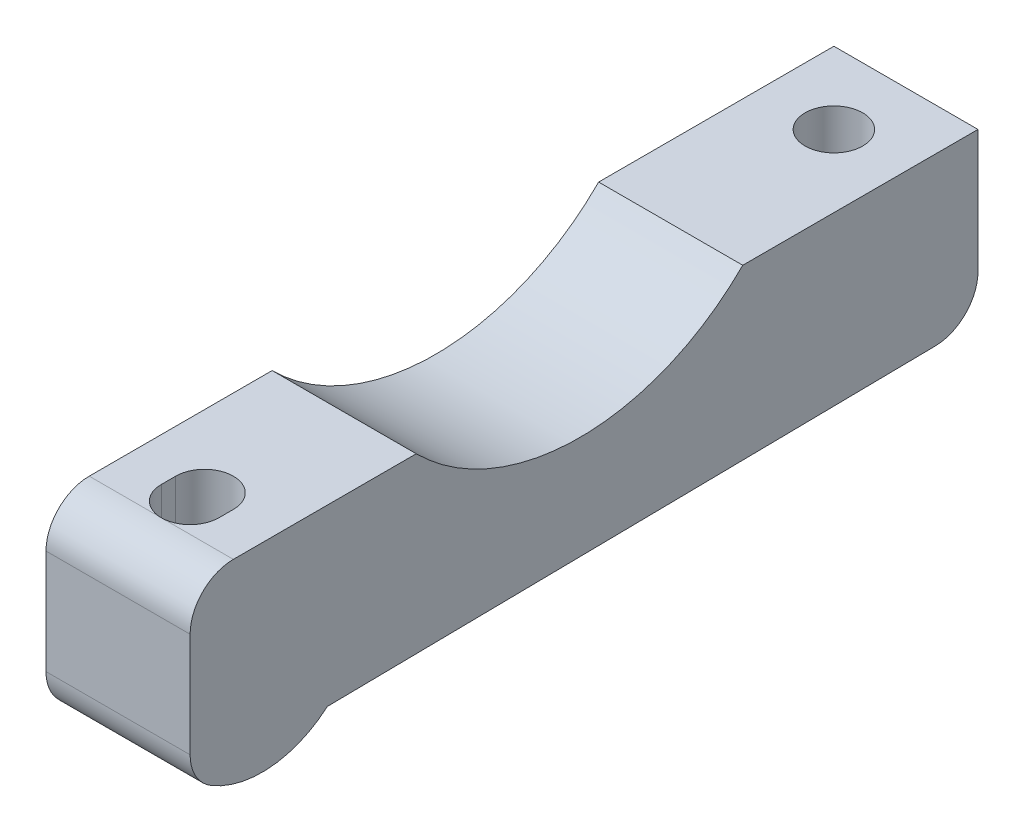
ISO-10303-21;
HEADER;
FILE_DESCRIPTION(('STEP AP214'),'2;1');
FILE_NAME('part.step','',(''),(''),'','','');
FILE_SCHEMA(('AUTOMOTIVE_DESIGN { 1 0 10303 214 1 1 1 1 }'));
ENDSEC;
DATA;
#1=APPLICATION_CONTEXT('core data for automotive mechanical design processes');
#2=APPLICATION_PROTOCOL_DEFINITION('international standard','automotive_design',2000,#1);
#3=PRODUCT_CONTEXT('',#1,'mechanical');
#4=PRODUCT('Part','Part','',(#3));
#5=PRODUCT_RELATED_PRODUCT_CATEGORY('part','',(#4));
#6=PRODUCT_DEFINITION_FORMATION('','',#4);
#7=PRODUCT_DEFINITION_CONTEXT('part definition',#1,'design');
#8=PRODUCT_DEFINITION('design','',#6,#7);
#9=PRODUCT_DEFINITION_SHAPE('','',#8);
#10=(LENGTH_UNIT() NAMED_UNIT(*) SI_UNIT(.MILLI.,.METRE.));
#11=(NAMED_UNIT(*) PLANE_ANGLE_UNIT() SI_UNIT($,.RADIAN.));
#12=(NAMED_UNIT(*) SI_UNIT($,.STERADIAN.) SOLID_ANGLE_UNIT());
#13=UNCERTAINTY_MEASURE_WITH_UNIT(LENGTH_MEASURE(1.E-05),#10,'distance_accuracy_value','');
#14=(GEOMETRIC_REPRESENTATION_CONTEXT(3) GLOBAL_UNCERTAINTY_ASSIGNED_CONTEXT((#13)) GLOBAL_UNIT_ASSIGNED_CONTEXT((#10,
#11,#12)) REPRESENTATION_CONTEXT('',''));
#15=CARTESIAN_POINT('',(0.,0.,0.));
#16=DIRECTION('',(0.,0.,1.));
#17=DIRECTION('',(1.,0.,0.));
#18=AXIS2_PLACEMENT_3D('',#15,#16,#17);
#19=CARTESIAN_POINT('',(10.,-48.1039360432918,78.0002606467157));
#20=DIRECTION('',(0.,0.999908795025806,0.0135056147598018));
#21=DIRECTION('',(0.,-0.0135056147598018,0.999908795025806));
#22=AXIS2_PLACEMENT_3D('',#19,#20,#21);
#23=PLANE('',#22);
#24=DIRECTION('',(0.,0.0135056147598018,-0.999908795025806));
#25=VECTOR('',#24,1.);
#26=CARTESIAN_POINT('',(1.37747997155113,-48.1039360432918,78.0002606467157));
#27=LINE('',#26,#25);
#28=CARTESIAN_POINT('',(1.37747997155111,-47.5898571434518,39.9396449376715));
#29=VERTEX_POINT('',#28);
#30=CARTESIAN_POINT('',(1.37747997155111,-47.5340471264958,35.8076651798224));
#31=VERTEX_POINT('',#30);
#32=EDGE_CURVE('E286',#29,#31,#27,.T.);
#33=ORIENTED_EDGE('',*,*,#32,.F.);
#34=DIRECTION('',(-0.866005655302022,0.0067532693234498,-0.49998859820836));
#35=VECTOR('',#34,1.);
#36=CARTESIAN_POINT('',(24.3270599960651,-47.7688221349812,53.1895911426136));
#37=LINE('',#36,#35);
#38=CARTESIAN_POINT('',(5.00000000000001,-47.6181062123025,42.0311078512413));
#39=VERTEX_POINT('',#38);
#40=EDGE_CURVE('E14',#39,#29,#37,.T.);
#41=ORIENTED_EDGE('',*,*,#40,.F.);
#42=DIRECTION('',(-0.866005655302021,-0.00675326932344981,0.499988598208361));
#43=VECTOR('',#42,1.);
#44=CARTESIAN_POINT('',(-6.82740204591432,-47.7103384407224,48.8596616062639));
#45=LINE('',#44,#43);
#46=CARTESIAN_POINT('',(8.62252002844889,-47.5898571434518,39.9396449376715));
#47=VERTEX_POINT('',#46);
#48=EDGE_CURVE('E54',#47,#39,#45,.T.);
#49=ORIENTED_EDGE('',*,*,#48,.F.);
#50=DIRECTION('',(0.,-0.0135056147598018,0.999908795025806));
#51=VECTOR('',#50,1.);
#52=CARTESIAN_POINT('',(8.62252002844891,-48.1039360432918,78.0002606467157));
#53=LINE('',#52,#51);
#54=CARTESIAN_POINT('',(8.62252002844889,-47.5340471264958,35.8076651798224));
#55=VERTEX_POINT('',#54);
#56=EDGE_CURVE('E255',#55,#47,#53,.T.);
#57=ORIENTED_EDGE('',*,*,#56,.F.);
#58=DIRECTION('',(-1.,0.,0.));
#59=VECTOR('',#58,1.);
#60=CARTESIAN_POINT('',(10.,-47.5340471264958,35.8076651798224));
#61=LINE('',#60,#59);
#62=CARTESIAN_POINT('',(10.,-47.5340471264958,35.8076651798224));
#63=VERTEX_POINT('',#62);
#64=EDGE_CURVE('E245',#63,#55,#61,.T.);
#65=ORIENTED_EDGE('',*,*,#64,.F.);
#66=DIRECTION('',(0.,0.0135056147598018,-0.999908795025806));
#67=VECTOR('',#66,1.);
#68=CARTESIAN_POINT('',(10.,-48.1039360432918,78.0002606467157));
#69=LINE('',#68,#67);
#70=CARTESIAN_POINT('',(10.,-48.1039360432918,78.0002606467157));
#71=VERTEX_POINT('',#70);
#72=EDGE_CURVE('E360',#71,#63,#69,.T.);
#73=ORIENTED_EDGE('',*,*,#72,.F.);
#74=DIRECTION('',(-1.,0.,0.));
#75=VECTOR('',#74,1.);
#76=CARTESIAN_POINT('',(10.,-48.1039360432918,78.0002606467157));
#77=LINE('',#76,#75);
#78=CARTESIAN_POINT('',(0.,-48.1039360432918,78.0002606467157));
#79=VERTEX_POINT('',#78);
#80=EDGE_CURVE('E248',#71,#79,#77,.T.);
#81=ORIENTED_EDGE('',*,*,#80,.T.);
#82=DIRECTION('',(0.,0.0135056147598018,-0.999908795025806));
#83=VECTOR('',#82,1.);
#84=CARTESIAN_POINT('',(0.,-48.1039360432918,78.0002606467157));
#85=LINE('',#84,#83);
#86=CARTESIAN_POINT('',(0.,-47.5340471264958,35.8076651798224));
#87=VERTEX_POINT('',#86);
#88=EDGE_CURVE('E377',#79,#87,#85,.T.);
#89=ORIENTED_EDGE('',*,*,#88,.T.);
#90=EDGE_CURVE('E244',#31,#87,#61,.T.);
#91=ORIENTED_EDGE('',*,*,#90,.F.);
#92=EDGE_LOOP('',(#33,#41,#49,#57,#65,#73,#81,#89,#91));
#93=FACE_BOUND('',#92,.T.);
#94=ADVANCED_FACE('F45',(#93),#23,.F.);
#95=CARTESIAN_POINT('',(10.,-44.5343207414184,35.8481820241018));
#96=DIRECTION('',(-1.,0.,0.));
#97=DIRECTION('',(0.,0.,1.));
#98=AXIS2_PLACEMENT_3D('',#95,#96,#97);
#99=CYLINDRICAL_SURFACE('',#98,3.);
#100=CARTESIAN_POINT('',(1.37747997155111,-44.5343207414184,35.8481820241018));
#101=DIRECTION('',(1.,0.,0.));
#102=DIRECTION('',(0.,0.,-1.));
#103=AXIS2_PLACEMENT_3D('',#100,#101,#102);
#104=CIRCLE('',#103,3.);
#105=CARTESIAN_POINT('',(1.37747997155111,-47.5329261731885,35.756719110532));
#106=VERTEX_POINT('',#105);
#107=EDGE_CURVE('E262',#31,#106,#104,.T.);
#108=ORIENTED_EDGE('',*,*,#107,.F.);
#109=ORIENTED_EDGE('',*,*,#90,.T.);
#110=CARTESIAN_POINT('',(0.,-44.5343207414184,35.8481820241018));
#111=DIRECTION('',(1.,0.,0.));
#112=DIRECTION('',(0.,0.,-1.));
#113=AXIS2_PLACEMENT_3D('',#110,#111,#112);
#114=CIRCLE('',#113,3.);
#115=CARTESIAN_POINT('',(0.,-44.5343207414184,32.8481820241018));
#116=VERTEX_POINT('',#115);
#117=EDGE_CURVE('E379',#87,#116,#114,.T.);
#118=ORIENTED_EDGE('',*,*,#117,.T.);
#119=DIRECTION('',(-1.,0.,0.));
#120=VECTOR('',#119,1.);
#121=CARTESIAN_POINT('',(10.,-44.5343207414184,32.8481820241018));
#122=LINE('',#121,#120);
#123=CARTESIAN_POINT('',(10.,-44.5343207414184,32.8481820241018));
#124=VERTEX_POINT('',#123);
#125=EDGE_CURVE('E241',#124,#116,#122,.T.);
#126=ORIENTED_EDGE('',*,*,#125,.F.);
#127=CARTESIAN_POINT('',(10.,-44.5343207414184,35.8481820241018));
#128=DIRECTION('',(1.,0.,0.));
#129=DIRECTION('',(0.,0.,-1.));
#130=AXIS2_PLACEMENT_3D('',#127,#128,#129);
#131=CIRCLE('',#130,3.);
#132=EDGE_CURVE('E362',#63,#124,#131,.T.);
#133=ORIENTED_EDGE('',*,*,#132,.F.);
#134=ORIENTED_EDGE('',*,*,#64,.T.);
#135=CARTESIAN_POINT('',(8.62252002844889,-44.5343207414184,35.8481820241018));
#136=DIRECTION('',(-1.,0.,0.));
#137=DIRECTION('',(0.,0.,1.));
#138=AXIS2_PLACEMENT_3D('',#135,#136,#137);
#139=CIRCLE('',#138,3.);
#140=CARTESIAN_POINT('',(8.62252002844889,-47.5329261731885,35.756719110532));
#141=VERTEX_POINT('',#140);
#142=EDGE_CURVE('E251',#141,#55,#139,.T.);
#143=ORIENTED_EDGE('',*,*,#142,.F.);
#144=CARTESIAN_POINT('',(8.78093844176006,-44.5343207414184,35.8481820241018));
#145=DIRECTION('',(-0.499999999999998,0.,0.86602540378444));
#146=DIRECTION('',(-0.86602540378444,0.,-0.499999999999998));
#147=AXIS2_PLACEMENT_3D('',#144,#145,#146);
#148=ELLIPSE('',#147,6.00000000000003,3.);
#149=CARTESIAN_POINT('',(5.,-46.5921921740417,33.6652561969622));
#150=VERTEX_POINT('',#149);
#151=EDGE_CURVE('E258',#150,#141,#148,.T.);
#152=ORIENTED_EDGE('',*,*,#151,.F.);
#153=CARTESIAN_POINT('',(1.21906155823997,-44.5343207414184,35.8481820241018));
#154=DIRECTION('',(0.5,0.,0.866025403784439));
#155=DIRECTION('',(-0.866025403784439,0.,0.5));
#156=AXIS2_PLACEMENT_3D('',#153,#154,#155);
#157=ELLIPSE('',#156,6.,3.);
#158=EDGE_CURVE('E260',#106,#150,#157,.T.);
#159=ORIENTED_EDGE('',*,*,#158,.F.);
#160=EDGE_LOOP('',(#108,#109,#118,#126,#133,#134,#143,#152,#159));
#161=FACE_BOUND('',#160,.T.);
#162=ADVANCED_FACE('F394',(#161),#99,.T.);
#163=CARTESIAN_POINT('',(10.,-42.9198410491219,82.5239953031053));
#164=DIRECTION('',(-1.,0.,0.));
#165=DIRECTION('',(0.,0.,1.));
#166=AXIS2_PLACEMENT_3D('',#163,#164,#165);
#167=CYLINDRICAL_SURFACE('',#166,6.88033546783859);
#168=CARTESIAN_POINT('',(3.,-49.8001765169605,82.5239953031054));
#169=CARTESIAN_POINT('',(2.99999908750125,-49.8001801191236,82.5790352856475));
#170=CARTESIAN_POINT('',(3.00227351354645,-49.799515272154,82.6340478316025));
#171=CARTESIAN_POINT('',(3.01133866120404,-49.7968870928086,82.7436579638859));
#172=CARTESIAN_POINT('',(3.01812852478686,-49.7949240071264,82.7982556270578));
#173=CARTESIAN_POINT('',(3.04516389881666,-49.7871610029691,82.9605748329965));
#174=CARTESIAN_POINT('',(3.07207570574423,-49.7794868508105,83.06717509479));
#175=CARTESIAN_POINT('',(3.1427711427662,-49.7599561568413,83.2741119244492));
#176=CARTESIAN_POINT('',(3.1865514705626,-49.7481004336823,83.3744497138351));
#177=CARTESIAN_POINT('',(3.28966070346656,-49.7214439270112,83.5664009925472));
#178=CARTESIAN_POINT('',(3.34899521404478,-49.7066420822295,83.6580113203796));
#179=CARTESIAN_POINT('',(3.48320834123886,-49.6752332256806,83.8323291297511));
#180=CARTESIAN_POINT('',(3.55842914771926,-49.6585911312054,83.9147666995699));
#181=CARTESIAN_POINT('',(3.72155640469726,-49.625589589224,84.0660589524453));
#182=CARTESIAN_POINT('',(3.80946559659227,-49.609230203656,84.1349106925776));
#183=CARTESIAN_POINT('',(3.99772932479587,-49.5782777752942,84.2584664592139));
#184=CARTESIAN_POINT('',(4.09830556302418,-49.5637287932854,84.3128447353406));
#185=CARTESIAN_POINT('',(4.30766096344512,-49.5385702160399,84.4038046570536));
#186=CARTESIAN_POINT('',(4.4164378926445,-49.5279595530531,84.4403911271584));
#187=CARTESIAN_POINT('',(4.63607550907942,-49.5122447463226,84.4937644728676));
#188=CARTESIAN_POINT('',(4.74680504491993,-49.5070024191648,84.5110493044696));
#189=CARTESIAN_POINT('',(4.969709265211,-49.5022061979605,84.5268831391609));
#190=CARTESIAN_POINT('',(5.0818836501859,-49.5026511434735,84.5254359643588));
#191=CARTESIAN_POINT('',(5.30048736436622,-49.509056589041,84.5042384740849));
#192=CARTESIAN_POINT('',(5.40698296056521,-49.5148308746578,84.4851060702752));
#193=CARTESIAN_POINT('',(5.61518150341124,-49.5309439392077,84.4300772915553));
#194=CARTESIAN_POINT('',(5.71688405284008,-49.5412830957157,84.3941795299156));
#195=CARTESIAN_POINT('',(5.91415178675121,-49.5655140068084,84.3061697822286));
#196=CARTESIAN_POINT('',(6.00961970554332,-49.5794503070672,84.253852569739));
#197=CARTESIAN_POINT('',(6.19062985521666,-49.6092827959936,84.1346322922063));
#198=CARTESIAN_POINT('',(6.27616995428165,-49.6251794040953,84.0677261032961));
#199=CARTESIAN_POINT('',(6.4384021598558,-49.6579009394484,83.9181405887993));
#200=CARTESIAN_POINT('',(6.51461936131665,-49.6747378978858,83.8349480609914));
#201=CARTESIAN_POINT('',(6.65214298929749,-49.7068956247485,83.6567316035264));
#202=CARTESIAN_POINT('',(6.71344563755355,-49.7222160084021,83.5617046850931));
#203=CARTESIAN_POINT('',(6.81967124099461,-49.749743202271,83.3616754048153));
#204=CARTESIAN_POINT('',(6.86448569301391,-49.7619292339841,83.2566124999489));
#205=CARTESIAN_POINT('',(6.93561796549548,-49.781652035342,83.0400623313098));
#206=CARTESIAN_POINT('',(6.96196283472578,-49.7891956019052,82.9285847220822));
#207=CARTESIAN_POINT('',(6.98573626739412,-49.7960413198251,82.7674031703964));
#208=CARTESIAN_POINT('',(6.99108511393889,-49.7975893552019,82.7188503945059));
#209=CARTESIAN_POINT('',(6.99821349841,-49.7996567719848,82.6215382310861));
#210=CARTESIAN_POINT('',(6.9999986101986,-49.8001777597295,82.5727792859211));
#211=CARTESIAN_POINT('',(7.00000000000005,-49.8001765169605,82.5239953031054));
#212=B_SPLINE_CURVE_WITH_KNOTS('',3,(#168,#169,#170,#171,#172,#173,#174,#175,#176,#177,#178,
#179,#180,#181,#182,#183,#184,#185,#186,#187,#188,#189,#190,#191,#192,#193,#194,#195,#196,#197,
#198,#199,#200,#201,#202,#203,#204,#205,#206,#207,#208,#209,#210,#211),.UNSPECIFIED.,.F.,.F.,(4,
2,2,2,2,2,2,2,2,2,2,2,2,2,2,2,2,2,2,2,2,4),(0.,0.16501507259854,0.329998797765138,
0.658922622017721,0.987782086564065,1.31676022995171,1.6537196697558,1.99075202083334,
2.3348281111708,2.67881084794893,3.01369807744446,3.34851697708793,3.67206244616124,
3.99563468170865,4.32342411926771,4.65128381384484,4.99192426566364,5.33265092137531,
5.67558129219864,6.01800838522245,6.16450463840033,6.31077158392046),.UNSPECIFIED.);
#213=CARTESIAN_POINT('',(3.,-49.8001765169605,82.5239953031053));
#214=VERTEX_POINT('',#213);
#215=CARTESIAN_POINT('',(7.,-49.8001765169605,82.5239953031054));
#216=VERTEX_POINT('',#215);
#217=EDGE_CURVE('E311',#214,#216,#212,.T.);
#218=ORIENTED_EDGE('',*,*,#217,.T.);
#219=CARTESIAN_POINT('',(7.,-42.9198410491219,82.5239953031053));
#220=DIRECTION('',(1.,0.,0.));
#221=DIRECTION('',(0.,0.,-1.));
#222=AXIS2_PLACEMENT_3D('',#219,#220,#221);
#223=CIRCLE('',#222,6.88033546783859);
#224=CARTESIAN_POINT('',(7.,-49.7271177549712,81.5239953031054));
#225=VERTEX_POINT('',#224);
#226=EDGE_CURVE('E357',#216,#225,#223,.T.);
#227=ORIENTED_EDGE('',*,*,#226,.T.);
#228=CARTESIAN_POINT('',(7.,-49.7271177549712,81.5239953031054));
#229=CARTESIAN_POINT('',(7.00000074170711,-49.7187665580087,81.4671183390384));
#230=CARTESIAN_POINT('',(6.99757256216272,-49.7096984131279,81.4103797605788));
#231=CARTESIAN_POINT('',(6.98794688672216,-49.6902279916637,81.2975597878095));
#232=CARTESIAN_POINT('',(6.98075109854785,-49.6798261938604,81.2414781655004));
#233=CARTESIAN_POINT('',(6.95221177059141,-49.6468402954943,81.0751323923562));
#234=CARTESIAN_POINT('',(6.92391487392261,-49.6224134919884,80.9663483007032));
#235=CARTESIAN_POINT('',(6.85001875815651,-49.5700182665163,80.755963269943));
#236=CARTESIAN_POINT('',(6.80443647124674,-49.5420533281945,80.6543554164086));
#237=CARTESIAN_POINT('',(6.69736602503537,-49.4842039222086,80.4604049169947));
#238=CARTESIAN_POINT('',(6.63586633722524,-49.454318075128,80.3680690541052));
#239=CARTESIAN_POINT('',(6.4957077969945,-49.3933734069796,80.1912947372448));
#240=CARTESIAN_POINT('',(6.4164579430118,-49.3623157884805,80.1073237168848));
#241=CARTESIAN_POINT('',(6.2441669669864,-49.3026429929203,79.95385000714));
#242=CARTESIAN_POINT('',(6.15112431228881,-49.274028087851,79.8843489277202));
#243=CARTESIAN_POINT('',(5.95346442974712,-49.2218407176655,79.7620675928889));
#244=CARTESIAN_POINT('',(5.84886110975543,-49.1982622915751,79.7092675348155));
#245=CARTESIAN_POINT('',(5.63081296141648,-49.1586268682049,79.6224662601337));
#246=CARTESIAN_POINT('',(5.51737558622959,-49.1425636089891,79.5884493883514));
#247=CARTESIAN_POINT('',(5.29499347328155,-49.1208584396604,79.5428906049931));
#248=CARTESIAN_POINT('',(5.1864562448145,-49.1144627975346,79.529718872924));
#249=CARTESIAN_POINT('',(4.96854074371529,-49.1103759485281,79.5212758684763));
#250=CARTESIAN_POINT('',(4.85916281702041,-49.1126813345336,79.5259975894538));
#251=CARTESIAN_POINT('',(4.65043180273638,-49.1252745321109,79.5521625532293));
#252=CARTESIAN_POINT('',(4.55089845405858,-49.135016447676,79.5724627416005));
#253=CARTESIAN_POINT('',(4.35681189117595,-49.1608795861889,79.6275539416848));
#254=CARTESIAN_POINT('',(4.26225949883532,-49.177001858191,79.6623473364119));
#255=CARTESIAN_POINT('',(4.07704437615876,-49.2148946324142,79.7466734848409));
#256=CARTESIAN_POINT('',(3.98663635671149,-49.2368442501307,79.7966826995449));
#257=CARTESIAN_POINT('',(3.81520380640131,-49.2843398219674,79.9094381698209));
#258=CARTESIAN_POINT('',(3.73418264515365,-49.3098870602851,79.9721889771494));
#259=CARTESIAN_POINT('',(3.57609291910247,-49.3652158153035,80.1151484231821));
#260=CARTESIAN_POINT('',(3.50004830721046,-49.395171239767,80.1964239203389));
#261=CARTESIAN_POINT('',(3.3624114114656,-49.45511563657,80.3704699549059));
#262=CARTESIAN_POINT('',(3.30082798052436,-49.4851046182254,80.4632474808606));
#263=CARTESIAN_POINT('',(3.19110292651067,-49.5445447459744,80.662900259408));
#264=CARTESIAN_POINT('',(3.14375012636133,-49.573900676143,80.7702389060521));
#265=CARTESIAN_POINT('',(3.06839487400949,-49.628508068959,80.9923900165121));
#266=CARTESIAN_POINT('',(3.04035923275427,-49.6537665141551,81.1071892887865));
#267=CARTESIAN_POINT('',(3.01512156844756,-49.6857634635036,81.2734445945388));
#268=CARTESIAN_POINT('',(3.00946104988689,-49.6947884728726,81.3232932517607));
#269=CARTESIAN_POINT('',(3.00190337317914,-49.7117668128479,81.4233897862033));
#270=CARTESIAN_POINT('',(3.00000141495516,-49.7197214982486,81.4736370718393));
#271=CARTESIAN_POINT('',(3.,-49.7271177549712,81.5239953031054));
#272=B_SPLINE_CURVE_WITH_KNOTS('',3,(#228,#229,#230,#231,#232,#233,#234,#235,#236,#237,#238,
#239,#240,#241,#242,#243,#244,#245,#246,#247,#248,#249,#250,#251,#252,#253,#254,#255,#256,#257,
#258,#259,#260,#261,#262,#263,#264,#265,#266,#267,#268,#269,#270,#271),.UNSPECIFIED.,.F.,.F.,(4,
2,2,2,2,2,2,2,2,2,2,2,2,2,2,2,2,2,2,2,2,4),(0.,0.172342720382519,0.344623742237611,
0.687931859715906,1.03090454917649,1.37412634226965,1.7311622087891,2.08823777888556,
2.44488835783689,2.80124122972367,3.12804346923447,3.45471775410895,3.75947631313533,
4.06428500121673,4.37984145960984,4.69551084510937,5.03979337313499,5.38428611932017,
5.74534526511055,6.1057825133481,6.2585794624316,6.41118114730429),.UNSPECIFIED.);
#273=CARTESIAN_POINT('',(3.,-49.7271177549712,81.5239953031054));
#274=VERTEX_POINT('',#273);
#275=EDGE_CURVE('E349',#225,#274,#272,.T.);
#276=ORIENTED_EDGE('',*,*,#275,.T.);
#277=CARTESIAN_POINT('',(3.,-42.9198410491219,82.5239953031053));
#278=DIRECTION('',(-1.,0.,0.));
#279=DIRECTION('',(0.,0.,1.));
#280=AXIS2_PLACEMENT_3D('',#277,#278,#279);
#281=CIRCLE('',#280,6.88033546783859);
#282=EDGE_CURVE('E326',#274,#214,#281,.T.);
#283=ORIENTED_EDGE('',*,*,#282,.T.);
#284=EDGE_LOOP('',(#218,#227,#276,#283));
#285=FACE_BOUND('',#284,.T.);
#286=CARTESIAN_POINT('',(0.,-42.9198410491219,82.5239953031053));
#287=DIRECTION('',(1.,0.,0.));
#288=DIRECTION('',(0.,0.,-1.));
#289=AXIS2_PLACEMENT_3D('',#286,#287,#288);
#290=CIRCLE('',#289,6.88033546783859);
#291=CARTESIAN_POINT('',(0.,-48.8158625813458,86.0702533649997));
#292=VERTEX_POINT('',#291);
#293=EDGE_CURVE('E356',#292,#79,#290,.T.);
#294=ORIENTED_EDGE('',*,*,#293,.T.);
#295=ORIENTED_EDGE('',*,*,#80,.F.);
#296=CARTESIAN_POINT('',(10.,-42.9198410491219,82.5239953031053));
#297=DIRECTION('',(1.,0.,0.));
#298=DIRECTION('',(0.,0.,-1.));
#299=AXIS2_PLACEMENT_3D('',#296,#297,#298);
#300=CIRCLE('',#299,6.88033546783859);
#301=CARTESIAN_POINT('',(10.,-48.8158625813458,86.0702533649997));
#302=VERTEX_POINT('',#301);
#303=EDGE_CURVE('E223',#302,#71,#300,.T.);
#304=ORIENTED_EDGE('',*,*,#303,.F.);
#305=DIRECTION('',(-1.,0.,0.));
#306=VECTOR('',#305,1.);
#307=CARTESIAN_POINT('',(10.,-48.8158625813458,86.0702533649997));
#308=LINE('',#307,#306);
#309=EDGE_CURVE('E224',#302,#292,#308,.T.);
#310=ORIENTED_EDGE('',*,*,#309,.T.);
#311=EDGE_LOOP('',(#294,#295,#304,#310));
#312=FACE_BOUND('',#311,.T.);
#313=ADVANCED_FACE('F47',(#285,#312),#167,.T.);
#314=CARTESIAN_POINT('',(10.,-44.5343207414184,32.8481820241018));
#315=DIRECTION('',(0.,0.,1.));
#316=DIRECTION('',(1.,0.,0.));
#317=AXIS2_PLACEMENT_3D('',#314,#315,#316);
#318=PLANE('',#317);
#319=DIRECTION('',(0.,1.,0.));
#320=VECTOR('',#319,1.);
#321=CARTESIAN_POINT('',(0.,-44.5343207414184,32.8481820241018));
#322=LINE('',#321,#320);
#323=CARTESIAN_POINT('',(0.,-35.9997701836426,32.8481820241018));
#324=VERTEX_POINT('',#323);
#325=EDGE_CURVE('E216',#116,#324,#322,.T.);
#326=ORIENTED_EDGE('',*,*,#325,.T.);
#327=DIRECTION('',(-1.,0.,0.));
#328=VECTOR('',#327,1.);
#329=CARTESIAN_POINT('',(10.,-35.9997701836426,32.8481820241018));
#330=LINE('',#329,#328);
#331=CARTESIAN_POINT('',(10.,-35.9997701836426,32.8481820241018));
#332=VERTEX_POINT('',#331);
#333=EDGE_CURVE('E238',#332,#324,#330,.T.);
#334=ORIENTED_EDGE('',*,*,#333,.F.);
#335=DIRECTION('',(0.,1.,0.));
#336=VECTOR('',#335,1.);
#337=CARTESIAN_POINT('',(10.,-44.5343207414184,32.8481820241018));
#338=LINE('',#337,#336);
#339=EDGE_CURVE('E364',#124,#332,#338,.T.);
#340=ORIENTED_EDGE('',*,*,#339,.F.);
#341=ORIENTED_EDGE('',*,*,#125,.T.);
#342=EDGE_LOOP('',(#326,#334,#340,#341));
#343=FACE_BOUND('',#342,.T.);
#344=ADVANCED_FACE('F383',(#343),#318,.F.);
#345=CARTESIAN_POINT('',(10.,-35.9997701836426,50.6373843584496));
#346=DIRECTION('',(0.,-1.,0.));
#347=DIRECTION('',(0.,0.,-1.));
#348=AXIS2_PLACEMENT_3D('',#345,#346,#347);
#349=PLANE('',#348);
#350=CARTESIAN_POINT('',(5.,-35.9997701836426,37.8481820241018));
#351=DIRECTION('',(0.,1.,0.));
#352=DIRECTION('',(0.,0.,1.));
#353=AXIS2_PLACEMENT_3D('',#350,#351,#352);
#354=CIRCLE('',#353,2.);
#355=CARTESIAN_POINT('',(5.,-35.9997701836426,39.8481820241018));
#356=VERTEX_POINT('',#355);
#357=EDGE_CURVE('E290',#356,#356,#354,.T.);
#358=ORIENTED_EDGE('',*,*,#357,.F.);
#359=EDGE_LOOP('',(#358));
#360=FACE_BOUND('',#359,.T.);
#361=DIRECTION('',(0.,0.,1.));
#362=VECTOR('',#361,1.);
#363=CARTESIAN_POINT('',(0.,-35.9997701836426,50.6373843584496));
#364=LINE('',#363,#362);
#365=CARTESIAN_POINT('',(0.,-35.9997701836426,49.1747393880104));
#366=VERTEX_POINT('',#365);
#367=EDGE_CURVE('E212',#324,#366,#364,.T.);
#368=ORIENTED_EDGE('',*,*,#367,.T.);
#369=DIRECTION('',(1.,0.,0.));
#370=VECTOR('',#369,1.);
#371=CARTESIAN_POINT('',(0.,-35.9997701836426,49.1747393880104));
#372=LINE('',#371,#370);
#373=CARTESIAN_POINT('',(10.,-35.9997701836426,49.1747393880104));
#374=VERTEX_POINT('',#373);
#375=EDGE_CURVE('E61',#366,#374,#372,.T.);
#376=ORIENTED_EDGE('',*,*,#375,.T.);
#377=DIRECTION('',(0.,0.,1.));
#378=VECTOR('',#377,1.);
#379=CARTESIAN_POINT('',(10.,-35.9997701836426,50.6373843584496));
#380=LINE('',#379,#378);
#381=EDGE_CURVE('E366',#332,#374,#380,.T.);
#382=ORIENTED_EDGE('',*,*,#381,.F.);
#383=ORIENTED_EDGE('',*,*,#333,.T.);
#384=EDGE_LOOP('',(#368,#376,#382,#383));
#385=FACE_BOUND('',#384,.T.);
#386=ADVANCED_FACE('F389',(#360,#385),#349,.F.);
#387=CARTESIAN_POINT('',(10.,-35.9997701836426,84.5239953031053));
#388=DIRECTION('',(0.,-1.,0.));
#389=DIRECTION('',(0.,0.,-1.));
#390=AXIS2_PLACEMENT_3D('',#387,#388,#389);
#391=PLANE('',#390);
#392=DIRECTION('',(0.,0.,1.));
#393=VECTOR('',#392,1.);
#394=CARTESIAN_POINT('',(10.,-35.9997701836426,84.5239953031053));
#395=LINE('',#394,#393);
#396=CARTESIAN_POINT('',(10.,-35.9997701836426,71.8318646503358));
#397=VERTEX_POINT('',#396);
#398=CARTESIAN_POINT('',(10.,-35.9997701836426,84.5239953031053));
#399=VERTEX_POINT('',#398);
#400=EDGE_CURVE('E206',#397,#399,#395,.T.);
#401=ORIENTED_EDGE('',*,*,#400,.F.);
#402=DIRECTION('',(1.,0.,0.));
#403=VECTOR('',#402,1.);
#404=CARTESIAN_POINT('',(0.,-35.9997701836426,71.8318646503358));
#405=LINE('',#404,#403);
#406=CARTESIAN_POINT('',(0.,-35.9997701836426,71.8318646503358));
#407=VERTEX_POINT('',#406);
#408=EDGE_CURVE('E191',#407,#397,#405,.T.);
#409=ORIENTED_EDGE('',*,*,#408,.F.);
#410=DIRECTION('',(0.,0.,1.));
#411=VECTOR('',#410,1.);
#412=CARTESIAN_POINT('',(0.,-35.9997701836426,84.5239953031053));
#413=LINE('',#412,#411);
#414=CARTESIAN_POINT('',(0.,-35.9997701836426,84.5239953031053));
#415=VERTEX_POINT('',#414);
#416=EDGE_CURVE('E203',#407,#415,#413,.T.);
#417=ORIENTED_EDGE('',*,*,#416,.T.);
#418=DIRECTION('',(-1.,0.,0.));
#419=VECTOR('',#418,1.);
#420=CARTESIAN_POINT('',(10.,-35.9997701836426,84.5239953031053));
#421=LINE('',#420,#419);
#422=CARTESIAN_POINT('',(5.,-35.9997701836427,84.5239953031053));
#423=VERTEX_POINT('',#422);
#424=EDGE_CURVE('E234',#423,#415,#421,.T.);
#425=ORIENTED_EDGE('',*,*,#424,.F.);
#426=CARTESIAN_POINT('',(5.,-35.9997701836427,82.5239953031054));
#427=DIRECTION('',(0.,1.,0.));
#428=DIRECTION('',(0.,0.,1.));
#429=AXIS2_PLACEMENT_3D('',#426,#427,#428);
#430=CIRCLE('',#429,2.);
#431=CARTESIAN_POINT('',(3.,-35.9997701836427,82.5239953031054));
#432=VERTEX_POINT('',#431);
#433=EDGE_CURVE('E303',#432,#423,#430,.T.);
#434=ORIENTED_EDGE('',*,*,#433,.F.);
#435=DIRECTION('',(0.,0.,1.));
#436=VECTOR('',#435,1.);
#437=CARTESIAN_POINT('',(3.,-35.9997701836427,82.5239953031054));
#438=LINE('',#437,#436);
#439=CARTESIAN_POINT('',(3.,-35.9997701836426,81.5239953031054));
#440=VERTEX_POINT('',#439);
#441=EDGE_CURVE('E299',#440,#432,#438,.T.);
#442=ORIENTED_EDGE('',*,*,#441,.F.);
#443=CARTESIAN_POINT('',(5.,-35.9997701836427,81.5239953031054));
#444=DIRECTION('',(0.,1.,0.));
#445=DIRECTION('',(0.,0.,1.));
#446=AXIS2_PLACEMENT_3D('',#443,#444,#445);
#447=CIRCLE('',#446,2.);
#448=CARTESIAN_POINT('',(7.,-35.9997701836427,81.5239953031054));
#449=VERTEX_POINT('',#448);
#450=EDGE_CURVE('E293',#449,#440,#447,.T.);
#451=ORIENTED_EDGE('',*,*,#450,.F.);
#452=DIRECTION('',(0.,0.,-1.));
#453=VECTOR('',#452,1.);
#454=CARTESIAN_POINT('',(7.,-35.9997701836427,82.5239953031054));
#455=LINE('',#454,#453);
#456=CARTESIAN_POINT('',(7.,-35.9997701836427,82.5239953031054));
#457=VERTEX_POINT('',#456);
#458=EDGE_CURVE('E305',#457,#449,#455,.T.);
#459=ORIENTED_EDGE('',*,*,#458,.F.);
#460=EDGE_CURVE('E302',#423,#457,#430,.T.);
#461=ORIENTED_EDGE('',*,*,#460,.F.);
#462=EDGE_CURVE('E235',#399,#423,#421,.T.);
#463=ORIENTED_EDGE('',*,*,#462,.F.);
#464=EDGE_LOOP('',(#401,#409,#417,#425,#434,#442,#451,#459,#461,#463));
#465=FACE_BOUND('',#464,.T.);
#466=ADVANCED_FACE('F201',(#465),#391,.F.);
#467=CARTESIAN_POINT('',(10.,-38.9997701836426,84.5239953031053));
#468=DIRECTION('',(-1.,0.,0.));
#469=DIRECTION('',(0.,0.,1.));
#470=AXIS2_PLACEMENT_3D('',#467,#468,#469);
#471=CYLINDRICAL_SURFACE('',#470,3.);
#472=CARTESIAN_POINT('',(0.,-38.9997701836426,84.5239953031053));
#473=DIRECTION('',(1.,0.,0.));
#474=DIRECTION('',(0.,0.,1.));
#475=AXIS2_PLACEMENT_3D('',#472,#473,#474);
#476=CIRCLE('',#475,3.);
#477=CARTESIAN_POINT('',(0.,-38.9997701836426,87.5239953031053));
#478=VERTEX_POINT('',#477);
#479=EDGE_CURVE('E211',#415,#478,#476,.T.);
#480=ORIENTED_EDGE('',*,*,#479,.T.);
#481=DIRECTION('',(-1.,0.,0.));
#482=VECTOR('',#481,1.);
#483=CARTESIAN_POINT('',(10.,-38.9997701836426,87.5239953031053));
#484=LINE('',#483,#482);
#485=CARTESIAN_POINT('',(10.,-38.9997701836426,87.5239953031053));
#486=VERTEX_POINT('',#485);
#487=EDGE_CURVE('E231',#486,#478,#484,.T.);
#488=ORIENTED_EDGE('',*,*,#487,.F.);
#489=CARTESIAN_POINT('',(10.,-38.9997701836426,84.5239953031053));
#490=DIRECTION('',(1.,0.,0.));
#491=DIRECTION('',(0.,0.,1.));
#492=AXIS2_PLACEMENT_3D('',#489,#490,#491);
#493=CIRCLE('',#492,3.);
#494=EDGE_CURVE('E370',#399,#486,#493,.T.);
#495=ORIENTED_EDGE('',*,*,#494,.F.);
#496=ORIENTED_EDGE('',*,*,#462,.T.);
#497=ORIENTED_EDGE('',*,*,#424,.T.);
#498=EDGE_LOOP('',(#480,#488,#495,#496,#497));
#499=FACE_BOUND('',#498,.T.);
#500=ADVANCED_FACE('F411',(#499),#471,.T.);
#501=CARTESIAN_POINT('',(10.,-46.2450483122811,87.5239953031053));
#502=DIRECTION('',(0.,0.,-1.));
#503=DIRECTION('',(-1.,0.,0.));
#504=AXIS2_PLACEMENT_3D('',#501,#502,#503);
#505=PLANE('',#504);
#506=DIRECTION('',(0.,-1.,0.));
#507=VECTOR('',#506,1.);
#508=CARTESIAN_POINT('',(0.,-46.2450483122811,87.5239953031053));
#509=LINE('',#508,#507);
#510=CARTESIAN_POINT('',(0.,-46.2450483122811,87.5239953031053));
#511=VERTEX_POINT('',#510);
#512=EDGE_CURVE('E214',#478,#511,#509,.T.);
#513=ORIENTED_EDGE('',*,*,#512,.T.);
#514=DIRECTION('',(-1.,0.,0.));
#515=VECTOR('',#514,1.);
#516=CARTESIAN_POINT('',(10.,-46.2450483122811,87.5239953031053));
#517=LINE('',#516,#515);
#518=CARTESIAN_POINT('',(10.,-46.2450483122811,87.5239953031053));
#519=VERTEX_POINT('',#518);
#520=EDGE_CURVE('E227',#519,#511,#517,.T.);
#521=ORIENTED_EDGE('',*,*,#520,.F.);
#522=DIRECTION('',(0.,-1.,0.));
#523=VECTOR('',#522,1.);
#524=CARTESIAN_POINT('',(10.,-46.2450483122811,87.5239953031053));
#525=LINE('',#524,#523);
#526=EDGE_CURVE('E372',#486,#519,#525,.T.);
#527=ORIENTED_EDGE('',*,*,#526,.F.);
#528=ORIENTED_EDGE('',*,*,#487,.T.);
#529=EDGE_LOOP('',(#513,#521,#527,#528));
#530=FACE_BOUND('',#529,.T.);
#531=ADVANCED_FACE('F406',(#530),#505,.F.);
#532=CARTESIAN_POINT('',(10.,-46.245048312281,84.5239953031053));
#533=DIRECTION('',(-1.,0.,0.));
#534=DIRECTION('',(0.,0.,1.));
#535=AXIS2_PLACEMENT_3D('',#532,#533,#534);
#536=CYLINDRICAL_SURFACE('',#535,3.);
#537=CARTESIAN_POINT('',(0.,-46.245048312281,84.5239953031053));
#538=DIRECTION('',(1.,0.,0.));
#539=DIRECTION('',(0.,0.,1.));
#540=AXIS2_PLACEMENT_3D('',#537,#538,#539);
#541=CIRCLE('',#540,3.);
#542=EDGE_CURVE('E221',#511,#292,#541,.T.);
#543=ORIENTED_EDGE('',*,*,#542,.T.);
#544=ORIENTED_EDGE('',*,*,#309,.F.);
#545=CARTESIAN_POINT('',(10.,-46.245048312281,84.5239953031053));
#546=DIRECTION('',(1.,0.,0.));
#547=DIRECTION('',(0.,0.,1.));
#548=AXIS2_PLACEMENT_3D('',#545,#546,#547);
#549=CIRCLE('',#548,3.);
#550=EDGE_CURVE('E228',#519,#302,#549,.T.);
#551=ORIENTED_EDGE('',*,*,#550,.F.);
#552=ORIENTED_EDGE('',*,*,#520,.T.);
#553=EDGE_LOOP('',(#543,#544,#551,#552));
#554=FACE_BOUND('',#553,.T.);
#555=ADVANCED_FACE('F403',(#554),#536,.T.);
#556=CARTESIAN_POINT('',(10.,-42.9198410491219,82.5239953031053));
#557=DIRECTION('',(1.,0.,0.));
#558=DIRECTION('',(0.,0.,-1.));
#559=AXIS2_PLACEMENT_3D('',#556,#557,#558);
#560=PLANE('',#559);
#561=CARTESIAN_POINT('',(10.,-24.7009353449602,60.5033020191731));
#562=DIRECTION('',(1.,0.,0.));
#563=DIRECTION('',(0.,0.,-1.));
#564=AXIS2_PLACEMENT_3D('',#561,#562,#563);
#565=CIRCLE('',#564,16.);
#566=EDGE_CURVE('E197',#397,#374,#565,.T.);
#567=ORIENTED_EDGE('',*,*,#566,.F.);
#568=ORIENTED_EDGE('',*,*,#400,.T.);
#569=ORIENTED_EDGE('',*,*,#494,.T.);
#570=ORIENTED_EDGE('',*,*,#526,.T.);
#571=ORIENTED_EDGE('',*,*,#550,.T.);
#572=ORIENTED_EDGE('',*,*,#303,.T.);
#573=ORIENTED_EDGE('',*,*,#72,.T.);
#574=ORIENTED_EDGE('',*,*,#132,.T.);
#575=ORIENTED_EDGE('',*,*,#339,.T.);
#576=ORIENTED_EDGE('',*,*,#381,.T.);
#577=EDGE_LOOP('',(#567,#568,#569,#570,#571,#572,#573,#574,#575,#576));
#578=FACE_BOUND('',#577,.T.);
#579=ADVANCED_FACE('F346',(#578),#560,.T.);
#580=CARTESIAN_POINT('',(0.,-42.9198410491219,82.5239953031053));
#581=DIRECTION('',(1.,0.,0.));
#582=DIRECTION('',(0.,0.,-1.));
#583=AXIS2_PLACEMENT_3D('',#580,#581,#582);
#584=PLANE('',#583);
#585=ORIENTED_EDGE('',*,*,#416,.F.);
#586=CARTESIAN_POINT('',(0.,-24.7009353449602,60.5033020191731));
#587=DIRECTION('',(1.,0.,0.));
#588=DIRECTION('',(0.,0.,-1.));
#589=AXIS2_PLACEMENT_3D('',#586,#587,#588);
#590=CIRCLE('',#589,16.);
#591=EDGE_CURVE('E188',#407,#366,#590,.T.);
#592=ORIENTED_EDGE('',*,*,#591,.T.);
#593=ORIENTED_EDGE('',*,*,#367,.F.);
#594=ORIENTED_EDGE('',*,*,#325,.F.);
#595=ORIENTED_EDGE('',*,*,#117,.F.);
#596=ORIENTED_EDGE('',*,*,#88,.F.);
#597=ORIENTED_EDGE('',*,*,#293,.F.);
#598=ORIENTED_EDGE('',*,*,#542,.F.);
#599=ORIENTED_EDGE('',*,*,#512,.F.);
#600=ORIENTED_EDGE('',*,*,#479,.F.);
#601=EDGE_LOOP('',(#585,#592,#593,#594,#595,#596,#597,#598,#599,#600));
#602=FACE_BOUND('',#601,.T.);
#603=ADVANCED_FACE('F209',(#602),#584,.F.);
#604=CARTESIAN_POINT('',(5.,-49.8001765169605,81.5239953031054));
#605=DIRECTION('',(0.,1.,0.));
#606=DIRECTION('',(0.,0.,1.));
#607=AXIS2_PLACEMENT_3D('',#604,#605,#606);
#608=CYLINDRICAL_SURFACE('',#607,2.);
#609=DIRECTION('',(0.,1.,0.));
#610=VECTOR('',#609,1.);
#611=CARTESIAN_POINT('',(7.,-49.8001765169605,81.5239953031054));
#612=LINE('',#611,#610);
#613=EDGE_CURVE('E309',#225,#449,#612,.T.);
#614=ORIENTED_EDGE('',*,*,#613,.T.);
#615=ORIENTED_EDGE('',*,*,#450,.T.);
#616=DIRECTION('',(0.,1.,0.));
#617=VECTOR('',#616,1.);
#618=CARTESIAN_POINT('',(3.,-49.8001765169605,81.5239953031054));
#619=LINE('',#618,#617);
#620=EDGE_CURVE('E308',#274,#440,#619,.T.);
#621=ORIENTED_EDGE('',*,*,#620,.F.);
#622=ORIENTED_EDGE('',*,*,#275,.F.);
#623=EDGE_LOOP('',(#614,#615,#621,#622));
#624=FACE_BOUND('',#623,.T.);
#625=ADVANCED_FACE('F341',(#624),#608,.F.);
#626=CARTESIAN_POINT('',(7.,-49.8001765169605,82.5239953031054));
#627=DIRECTION('',(1.,0.,0.));
#628=DIRECTION('',(0.,0.,-1.));
#629=AXIS2_PLACEMENT_3D('',#626,#627,#628);
#630=PLANE('',#629);
#631=DIRECTION('',(0.,1.,0.));
#632=VECTOR('',#631,1.);
#633=CARTESIAN_POINT('',(7.,-49.8001765169605,82.5239953031054));
#634=LINE('',#633,#632);
#635=EDGE_CURVE('E312',#216,#457,#634,.T.);
#636=ORIENTED_EDGE('',*,*,#635,.T.);
#637=ORIENTED_EDGE('',*,*,#458,.T.);
#638=ORIENTED_EDGE('',*,*,#613,.F.);
#639=ORIENTED_EDGE('',*,*,#226,.F.);
#640=EDGE_LOOP('',(#636,#637,#638,#639));
#641=FACE_BOUND('',#640,.T.);
#642=ADVANCED_FACE('F336',(#641),#630,.F.);
#643=CARTESIAN_POINT('',(3.,-49.8001765169605,82.5239953031054));
#644=DIRECTION('',(-1.,0.,0.));
#645=DIRECTION('',(0.,0.,1.));
#646=AXIS2_PLACEMENT_3D('',#643,#644,#645);
#647=PLANE('',#646);
#648=ORIENTED_EDGE('',*,*,#620,.T.);
#649=ORIENTED_EDGE('',*,*,#441,.T.);
#650=DIRECTION('',(0.,1.,0.));
#651=VECTOR('',#650,1.);
#652=CARTESIAN_POINT('',(3.,-49.8001765169605,82.5239953031054));
#653=LINE('',#652,#651);
#654=EDGE_CURVE('E315',#214,#432,#653,.T.);
#655=ORIENTED_EDGE('',*,*,#654,.F.);
#656=ORIENTED_EDGE('',*,*,#282,.F.);
#657=EDGE_LOOP('',(#648,#649,#655,#656));
#658=FACE_BOUND('',#657,.T.);
#659=ADVANCED_FACE('F334',(#658),#647,.F.);
#660=CARTESIAN_POINT('',(5.,-49.8001765169605,82.5239953031054));
#661=DIRECTION('',(0.,1.,0.));
#662=DIRECTION('',(0.,0.,1.));
#663=AXIS2_PLACEMENT_3D('',#660,#661,#662);
#664=CYLINDRICAL_SURFACE('',#663,2.);
#665=ORIENTED_EDGE('',*,*,#654,.T.);
#666=ORIENTED_EDGE('',*,*,#433,.T.);
#667=ORIENTED_EDGE('',*,*,#460,.T.);
#668=ORIENTED_EDGE('',*,*,#635,.F.);
#669=ORIENTED_EDGE('',*,*,#217,.F.);
#670=EDGE_LOOP('',(#665,#666,#667,#668,#669));
#671=FACE_BOUND('',#670,.T.);
#672=ADVANCED_FACE('F328',(#671),#664,.F.);
#673=CARTESIAN_POINT('',(5.,-49.8001765169605,37.8481820241018));
#674=DIRECTION('',(0.,1.,0.));
#675=DIRECTION('',(0.,0.,1.));
#676=AXIS2_PLACEMENT_3D('',#673,#674,#675);
#677=CYLINDRICAL_SURFACE('',#676,2.);
#678=CARTESIAN_POINT('',(5.,-44.6997701836426,37.8481820241018));
#679=DIRECTION('',(0.,1.,0.));
#680=DIRECTION('',(0.,0.,1.));
#681=AXIS2_PLACEMENT_3D('',#678,#679,#680);
#682=CIRCLE('',#681,2.);
#683=CARTESIAN_POINT('',(5.,-44.6997701836426,39.8481820241018));
#684=VERTEX_POINT('',#683);
#685=EDGE_CURVE('E252',#684,#684,#682,.F.);
#686=ORIENTED_EDGE('',*,*,#685,.T.);
#687=EDGE_LOOP('',(#686));
#688=FACE_BOUND('',#687,.T.);
#689=ORIENTED_EDGE('',*,*,#357,.T.);
#690=EDGE_LOOP('',(#689));
#691=FACE_BOUND('',#690,.T.);
#692=ADVANCED_FACE('F333',(#688,#691),#677,.F.);
#693=CARTESIAN_POINT('',(1.37747997155111,-44.6997701836426,39.9396449376715));
#694=DIRECTION('',(0.5,0.,-0.866025403784439));
#695=DIRECTION('',(-0.866025403784439,0.,-0.5));
#696=AXIS2_PLACEMENT_3D('',#693,#694,#695);
#697=PLANE('',#696);
#698=ORIENTED_EDGE('',*,*,#40,.T.);
#699=DIRECTION('',(0.,-1.,0.));
#700=VECTOR('',#699,1.);
#701=CARTESIAN_POINT('',(1.37747997155111,-44.6997701836426,39.9396449376715));
#702=LINE('',#701,#700);
#703=CARTESIAN_POINT('',(1.37747997155111,-44.6997701836426,39.9396449376715));
#704=VERTEX_POINT('',#703);
#705=EDGE_CURVE('E282',#704,#29,#702,.T.);
#706=ORIENTED_EDGE('',*,*,#705,.F.);
#707=DIRECTION('',(0.866025403784439,0.,0.5));
#708=VECTOR('',#707,1.);
#709=CARTESIAN_POINT('',(1.37747997155111,-44.6997701836426,39.9396449376715));
#710=LINE('',#709,#708);
#711=CARTESIAN_POINT('',(5.00000000000001,-44.6997701836426,42.0311078512413));
#712=VERTEX_POINT('',#711);
#713=EDGE_CURVE('E281',#704,#712,#710,.T.);
#714=ORIENTED_EDGE('',*,*,#713,.T.);
#715=DIRECTION('',(0.,-1.,0.));
#716=VECTOR('',#715,1.);
#717=CARTESIAN_POINT('',(5.00000000000001,-44.6997701836426,42.0311078512413));
#718=LINE('',#717,#716);
#719=EDGE_CURVE('E269',#712,#39,#718,.T.);
#720=ORIENTED_EDGE('',*,*,#719,.T.);
#721=EDGE_LOOP('',(#698,#706,#714,#720));
#722=FACE_BOUND('',#721,.T.);
#723=ADVANCED_FACE('F277',(#722),#697,.T.);
#724=CARTESIAN_POINT('',(5.00000000000001,-44.6997701836426,42.0311078512413));
#725=DIRECTION('',(-0.5,0.,-0.866025403784438));
#726=DIRECTION('',(-0.866025403784439,0.,0.5));
#727=AXIS2_PLACEMENT_3D('',#724,#725,#726);
#728=PLANE('',#727);
#729=ORIENTED_EDGE('',*,*,#48,.T.);
#730=ORIENTED_EDGE('',*,*,#719,.F.);
#731=DIRECTION('',(0.866025403784438,0.,-0.5));
#732=VECTOR('',#731,1.);
#733=CARTESIAN_POINT('',(5.00000000000001,-44.6997701836426,42.0311078512413));
#734=LINE('',#733,#732);
#735=CARTESIAN_POINT('',(8.62252002844889,-44.6997701836426,39.9396449376715));
#736=VERTEX_POINT('',#735);
#737=EDGE_CURVE('E633',#712,#736,#734,.T.);
#738=ORIENTED_EDGE('',*,*,#737,.T.);
#739=DIRECTION('',(0.,-1.,0.));
#740=VECTOR('',#739,1.);
#741=CARTESIAN_POINT('',(8.62252002844889,-44.6997701836426,39.9396449376715));
#742=LINE('',#741,#740);
#743=EDGE_CURVE('E272',#736,#47,#742,.T.);
#744=ORIENTED_EDGE('',*,*,#743,.T.);
#745=EDGE_LOOP('',(#729,#730,#738,#744));
#746=FACE_BOUND('',#745,.T.);
#747=ADVANCED_FACE('F268',(#746),#728,.T.);
#748=CARTESIAN_POINT('',(8.62252002844889,-44.6997701836426,35.756719110532));
#749=DIRECTION('',(-0.499999999999998,0.,0.86602540378444));
#750=DIRECTION('',(0.86602540378444,0.,0.499999999999998));
#751=AXIS2_PLACEMENT_3D('',#748,#749,#750);
#752=PLANE('',#751);
#753=ORIENTED_EDGE('',*,*,#151,.T.);
#754=DIRECTION('',(0.,-1.,0.));
#755=VECTOR('',#754,1.);
#756=CARTESIAN_POINT('',(8.62252002844889,-44.6997701836426,35.756719110532));
#757=LINE('',#756,#755);
#758=CARTESIAN_POINT('',(8.62252002844889,-44.6997701836426,35.756719110532));
#759=VERTEX_POINT('',#758);
#760=EDGE_CURVE('E69',#759,#141,#757,.T.);
#761=ORIENTED_EDGE('',*,*,#760,.F.);
#762=DIRECTION('',(-0.86602540378444,0.,-0.499999999999998));
#763=VECTOR('',#762,1.);
#764=CARTESIAN_POINT('',(8.62252002844889,-44.6997701836426,35.756719110532));
#765=LINE('',#764,#763);
#766=CARTESIAN_POINT('',(5.,-44.6997701836426,33.6652561969622));
#767=VERTEX_POINT('',#766);
#768=EDGE_CURVE('E617',#759,#767,#765,.T.);
#769=ORIENTED_EDGE('',*,*,#768,.T.);
#770=DIRECTION('',(0.,-1.,0.));
#771=VECTOR('',#770,1.);
#772=CARTESIAN_POINT('',(5.,-44.6997701836426,33.6652561969622));
#773=LINE('',#772,#771);
#774=EDGE_CURVE('E256',#767,#150,#773,.T.);
#775=ORIENTED_EDGE('',*,*,#774,.T.);
#776=EDGE_LOOP('',(#753,#761,#769,#775));
#777=FACE_BOUND('',#776,.T.);
#778=ADVANCED_FACE('F551',(#777),#752,.T.);
#779=CARTESIAN_POINT('',(5.,-44.6997701836426,33.6652561969622));
#780=DIRECTION('',(0.5,0.,0.866025403784439));
#781=DIRECTION('',(0.866025403784439,0.,-0.5));
#782=AXIS2_PLACEMENT_3D('',#779,#780,#781);
#783=PLANE('',#782);
#784=ORIENTED_EDGE('',*,*,#158,.T.);
#785=ORIENTED_EDGE('',*,*,#774,.F.);
#786=DIRECTION('',(-0.866025403784439,0.,0.5));
#787=VECTOR('',#786,1.);
#788=CARTESIAN_POINT('',(5.,-44.6997701836426,33.6652561969622));
#789=LINE('',#788,#787);
#790=CARTESIAN_POINT('',(1.37747997155111,-44.6997701836426,35.756719110532));
#791=VERTEX_POINT('',#790);
#792=EDGE_CURVE('E623',#767,#791,#789,.T.);
#793=ORIENTED_EDGE('',*,*,#792,.T.);
#794=DIRECTION('',(0.,-1.,0.));
#795=VECTOR('',#794,1.);
#796=CARTESIAN_POINT('',(1.37747997155111,-44.6997701836426,35.756719110532));
#797=LINE('',#796,#795);
#798=EDGE_CURVE('E639',#791,#106,#797,.T.);
#799=ORIENTED_EDGE('',*,*,#798,.T.);
#800=EDGE_LOOP('',(#784,#785,#793,#799));
#801=FACE_BOUND('',#800,.T.);
#802=ADVANCED_FACE('F559',(#801),#783,.T.);
#803=CARTESIAN_POINT('',(1.37747997155111,-44.6997701836426,35.756719110532));
#804=DIRECTION('',(1.,0.,0.));
#805=DIRECTION('',(0.,0.,-1.));
#806=AXIS2_PLACEMENT_3D('',#803,#804,#805);
#807=PLANE('',#806);
#808=ORIENTED_EDGE('',*,*,#32,.T.);
#809=ORIENTED_EDGE('',*,*,#107,.T.);
#810=ORIENTED_EDGE('',*,*,#798,.F.);
#811=DIRECTION('',(0.,0.,1.));
#812=VECTOR('',#811,1.);
#813=CARTESIAN_POINT('',(1.37747997155111,-44.6997701836426,35.756719110532));
#814=LINE('',#813,#812);
#815=EDGE_CURVE('E627',#791,#704,#814,.T.);
#816=ORIENTED_EDGE('',*,*,#815,.T.);
#817=ORIENTED_EDGE('',*,*,#705,.T.);
#818=EDGE_LOOP('',(#808,#809,#810,#816,#817));
#819=FACE_BOUND('',#818,.T.);
#820=ADVANCED_FACE('F568',(#819),#807,.T.);
#821=CARTESIAN_POINT('',(8.62252002844889,-44.6997701836426,39.9396449376715));
#822=DIRECTION('',(-1.,0.,0.));
#823=DIRECTION('',(0.,0.,1.));
#824=AXIS2_PLACEMENT_3D('',#821,#822,#823);
#825=PLANE('',#824);
#826=ORIENTED_EDGE('',*,*,#56,.T.);
#827=ORIENTED_EDGE('',*,*,#743,.F.);
#828=DIRECTION('',(0.,0.,-1.));
#829=VECTOR('',#828,1.);
#830=CARTESIAN_POINT('',(8.62252002844889,-44.6997701836426,39.9396449376715));
#831=LINE('',#830,#829);
#832=EDGE_CURVE('E621',#736,#759,#831,.T.);
#833=ORIENTED_EDGE('',*,*,#832,.T.);
#834=ORIENTED_EDGE('',*,*,#760,.T.);
#835=ORIENTED_EDGE('',*,*,#142,.T.);
#836=EDGE_LOOP('',(#826,#827,#833,#834,#835));
#837=FACE_BOUND('',#836,.T.);
#838=ADVANCED_FACE('F577',(#837),#825,.T.);
#839=CARTESIAN_POINT('',(0.,-44.6997701836426,0.));
#840=DIRECTION('',(0.,1.,0.));
#841=DIRECTION('',(0.,0.,1.));
#842=AXIS2_PLACEMENT_3D('',#839,#840,#841);
#843=PLANE('',#842);
#844=ORIENTED_EDGE('',*,*,#768,.F.);
#845=ORIENTED_EDGE('',*,*,#832,.F.);
#846=ORIENTED_EDGE('',*,*,#737,.F.);
#847=ORIENTED_EDGE('',*,*,#713,.F.);
#848=ORIENTED_EDGE('',*,*,#815,.F.);
#849=ORIENTED_EDGE('',*,*,#792,.F.);
#850=EDGE_LOOP('',(#844,#845,#846,#847,#848,#849));
#851=FACE_BOUND('',#850,.T.);
#852=ORIENTED_EDGE('',*,*,#685,.F.);
#853=EDGE_LOOP('',(#852));
#854=FACE_BOUND('',#853,.T.);
#855=ADVANCED_FACE('F585',(#851,#854),#843,.F.);
#856=CARTESIAN_POINT('',(0.,-24.7009353449602,60.5033020191731));
#857=DIRECTION('',(1.,0.,0.));
#858=DIRECTION('',(0.,0.,-1.));
#859=AXIS2_PLACEMENT_3D('',#856,#857,#858);
#860=CYLINDRICAL_SURFACE('',#859,16.);
#861=ORIENTED_EDGE('',*,*,#566,.T.);
#862=ORIENTED_EDGE('',*,*,#375,.F.);
#863=ORIENTED_EDGE('',*,*,#591,.F.);
#864=ORIENTED_EDGE('',*,*,#408,.T.);
#865=EDGE_LOOP('',(#861,#862,#863,#864));
#866=FACE_BOUND('',#865,.T.);
#867=ADVANCED_FACE('F190',(#866),#860,.F.);
#868=CLOSED_SHELL('',(#94,#162,#313,#344,#386,#466,#500,#531,#555,#579,#603,#625,#642,#659,#672,
#692,#723,#747,#778,#802,#820,#838,#855,#867));
#869=MANIFOLD_SOLID_BREP('B2',#868);
#870=ADVANCED_BREP_SHAPE_REPRESENTATION('',(#18,#869),#14);
#871=SHAPE_DEFINITION_REPRESENTATION(#9,#870);
ENDSEC;
END-ISO-10303-21;
